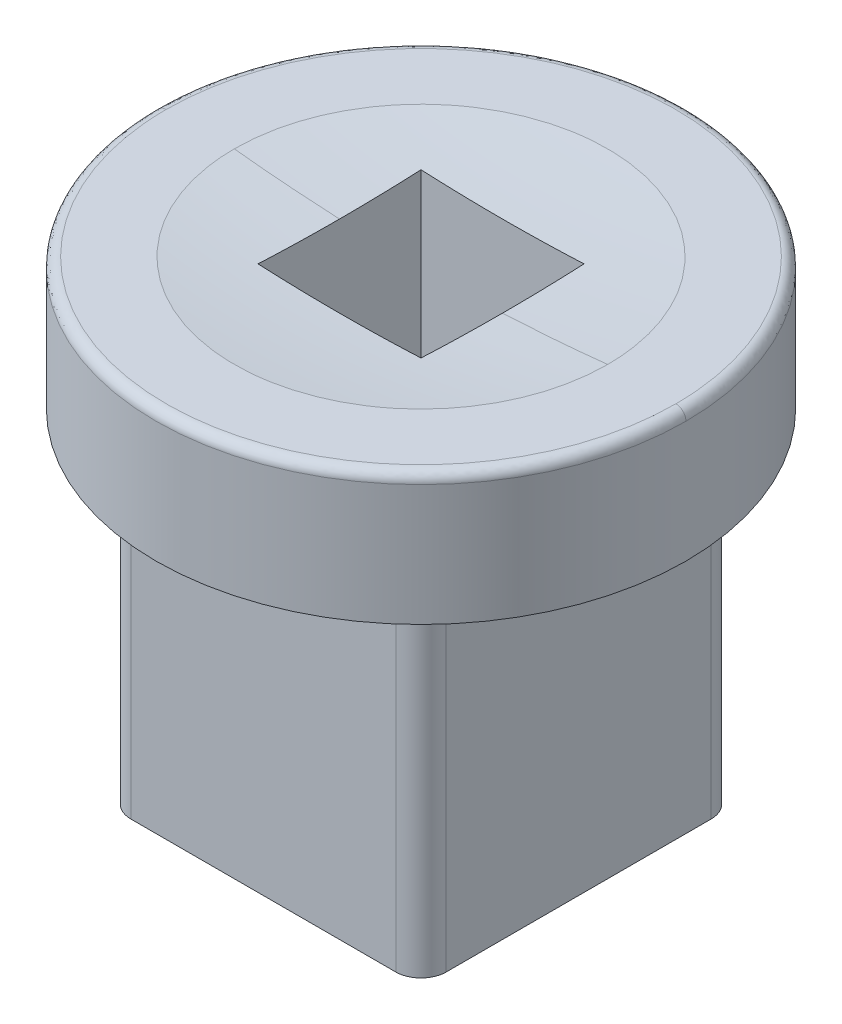
ISO-10303-21;
HEADER;
FILE_DESCRIPTION(('STEP AP214'),'2;1');
FILE_NAME('part.step','',(''),(''),'','','');
FILE_SCHEMA(('AUTOMOTIVE_DESIGN { 1 0 10303 214 1 1 1 1 }'));
ENDSEC;
DATA;
#1=APPLICATION_CONTEXT('core data for automotive mechanical design processes');
#2=APPLICATION_PROTOCOL_DEFINITION('international standard','automotive_design',2000,#1);
#3=PRODUCT_CONTEXT('',#1,'mechanical');
#4=PRODUCT('Part','Part','',(#3));
#5=PRODUCT_RELATED_PRODUCT_CATEGORY('part','',(#4));
#6=PRODUCT_DEFINITION_FORMATION('','',#4);
#7=PRODUCT_DEFINITION_CONTEXT('part definition',#1,'design');
#8=PRODUCT_DEFINITION('design','',#6,#7);
#9=PRODUCT_DEFINITION_SHAPE('','',#8);
#10=(LENGTH_UNIT() NAMED_UNIT(*) SI_UNIT(.MILLI.,.METRE.));
#11=(NAMED_UNIT(*) PLANE_ANGLE_UNIT() SI_UNIT($,.RADIAN.));
#12=(NAMED_UNIT(*) SI_UNIT($,.STERADIAN.) SOLID_ANGLE_UNIT());
#13=UNCERTAINTY_MEASURE_WITH_UNIT(LENGTH_MEASURE(1.E-05),#10,'distance_accuracy_value','');
#14=(GEOMETRIC_REPRESENTATION_CONTEXT(3) GLOBAL_UNCERTAINTY_ASSIGNED_CONTEXT((#13)) GLOBAL_UNIT_ASSIGNED_CONTEXT((#10,
#11,#12)) REPRESENTATION_CONTEXT('',''));
#15=CARTESIAN_POINT('',(0.,0.,0.));
#16=DIRECTION('',(0.,0.,1.));
#17=DIRECTION('',(1.,0.,0.));
#18=AXIS2_PLACEMENT_3D('',#15,#16,#17);
#19=CARTESIAN_POINT('',(1.60246612592846,6.28742605089468,0.));
#20=CARTESIAN_POINT('',(1.60246612592847,6.28742605089468,-3.20493225185692));
#21=CARTESIAN_POINT('',(-1.60246612592846,6.28742605089468,-3.20493225185693));
#22=CARTESIAN_POINT('',(-1.60246612592846,6.28742605089468,0.));
#23=CARTESIAN_POINT('',(2.30319517885633,6.32017536621334,0.));
#24=CARTESIAN_POINT('',(2.30319517885634,6.32017536621334,-4.60639035771267));
#25=CARTESIAN_POINT('',(-2.30319517885633,6.32017536621334,-4.60639035771268));
#26=CARTESIAN_POINT('',(-2.30319517885633,6.32017536621334,0.));
#27=CARTESIAN_POINT('',(3.00259213919021,6.37438361655492,0.));
#28=CARTESIAN_POINT('',(3.00259213919022,6.37438361655492,-6.00518427838042));
#29=CARTESIAN_POINT('',(-3.00259213919021,6.37438361655492,-6.00518427838043));
#30=CARTESIAN_POINT('',(-3.00259213919021,6.37438361655492,0.));
#31=CARTESIAN_POINT('',(3.70000000001531,6.45,0.));
#32=CARTESIAN_POINT('',(3.70000000001532,6.45,-7.40000000003062));
#33=CARTESIAN_POINT('',(-3.70000000001531,6.45,-7.40000000003063));
#34=CARTESIAN_POINT('',(-3.70000000001531,6.45,0.));
#35=(BOUNDED_SURFACE() B_SPLINE_SURFACE(3,3,((#19,#20,#21,#22),(#23,#24,#25,#26),(#27,#28,#29,
#30),(#31,#32,#33,#34)),.UNSPECIFIED.,.F.,.F.,.F.) B_SPLINE_SURFACE_WITH_KNOTS((4,4),(4,4),
(0.0134648712012432,0.98076619568123),(0.,1.),
.UNSPECIFIED.) GEOMETRIC_REPRESENTATION_ITEM() RATIONAL_B_SPLINE_SURFACE(((0.999986664041515,
0.333328888013838,0.333328888013838,0.999986664041515),(0.999671675900725,0.333223891966908,
0.333223891966908,0.999671675900725),(0.999669808465663,0.333223269488554,0.333223269488554,
0.999669808465663),(0.999981061736329,0.333327020578776,0.333327020578776,0.999981061736329))) REPRESENTATION_ITEM('') SURFACE());
#36=CARTESIAN_POINT('',(1.60246612592846,6.28742605089468,0.));
#37=CARTESIAN_POINT('',(2.30319517885633,6.32017536621333,0.));
#38=CARTESIAN_POINT('',(3.00259213919021,6.37438361655492,0.));
#39=CARTESIAN_POINT('',(3.70000000001531,6.45,0.));
#40=(BOUNDED_CURVE() B_SPLINE_CURVE(3,(#36,#37,#38,#39),.UNSPECIFIED.,.F.,
.F.) B_SPLINE_CURVE_WITH_KNOTS((4,4),(0.0134648712012412,0.98076619568123),
.UNSPECIFIED.) CURVE() GEOMETRIC_REPRESENTATION_ITEM() RATIONAL_B_SPLINE_CURVE((0.999986664041515,
0.999671675900725,0.999669808465663,0.999981061736329)) REPRESENTATION_ITEM(''));
#41=CARTESIAN_POINT('',(3.70000000001531,6.45,0.));
#42=VERTEX_POINT('',#41);
#43=CARTESIAN_POINT('',(1.615,6.28801413072135,0.));
#44=VERTEX_POINT('',#43);
#45=EDGE_CURVE('E130',#42,#44,#40,.F.);
#46=CARTESIAN_POINT('',(-3.70000000001531,6.45,0.));
#47=CARTESIAN_POINT('',(-3.70000996933506,6.45,-0.104065747110192));
#48=CARTESIAN_POINT('',(-3.695609624673,6.45,-0.208126765361193));
#49=CARTESIAN_POINT('',(-3.67806546197529,6.45,-0.415504310503129));
#50=CARTESIAN_POINT('',(-3.66492206259416,6.45,-0.518820872802333));
#51=CARTESIAN_POINT('',(-3.62998121590967,6.45,-0.723912470911236));
#52=CARTESIAN_POINT('',(-3.60818985820135,6.45,-0.825688539241989));
#53=CARTESIAN_POINT('',(-3.55612988346957,6.45,-1.0270183028877));
#54=CARTESIAN_POINT('',(-3.52586136945857,6.45,-1.12657202519223));
#55=CARTESIAN_POINT('',(-3.42258568149041,6.45000000000001,-1.42093586617541));
#56=CARTESIAN_POINT('',(-3.33709348688781,6.45,-1.61153550480342));
#57=CARTESIAN_POINT('',(-3.13538235508832,6.45,-1.97553244157834));
#58=CARTESIAN_POINT('',(-3.01916945442626,6.45,-2.14893311008045));
#59=CARTESIAN_POINT('',(-2.75927010205907,6.45,-2.47379728345372));
#60=CARTESIAN_POINT('',(-2.61558304468113,6.45,-2.62526030457602));
#61=CARTESIAN_POINT('',(-2.30480071448262,6.45,-2.90192918620794));
#62=CARTESIAN_POINT('',(-2.13770188012987,6.45,-3.02713104447086));
#63=CARTESIAN_POINT('',(-1.78486213469881,6.45,-3.24769895724202));
#64=CARTESIAN_POINT('',(-1.59912204690047,6.45,-3.3430663286076));
#65=CARTESIAN_POINT('',(-1.21427959257996,6.45,-3.50125768589281));
#66=CARTESIAN_POINT('',(-1.01517808174731,6.44999999999999,-3.56408375357364));
#67=CARTESIAN_POINT('',(-0.609249331839994,6.44999999999999,-3.65542007830035));
#68=CARTESIAN_POINT('',(-0.402421934533885,6.45,-3.68392963212279));
#69=CARTESIAN_POINT('',(0.0130883851862026,6.45,-3.7058213371475));
#70=CARTESIAN_POINT('',(0.221771350168899,6.44999999999999,-3.69920268038442));
#71=CARTESIAN_POINT('',(0.635062019699585,6.44999999999999,-3.65102429412023));
#72=CARTESIAN_POINT('',(0.839669764628466,6.45,-3.60946491101928));
#73=CARTESIAN_POINT('',(1.23900326382597,6.45,-3.49258538739663));
#74=CARTESIAN_POINT('',(1.43372904944246,6.45,-3.41726535397894));
#75=CARTESIAN_POINT('',(1.80777656844501,6.45,-3.23500052538178));
#76=CARTESIAN_POINT('',(1.98709789795484,6.45,-3.12805490136438));
#77=CARTESIAN_POINT('',(2.32523181409547,6.45,-2.88558064256865));
#78=CARTESIAN_POINT('',(2.48404541027658,6.45,-2.75005341566488));
#79=CARTESIAN_POINT('',(2.77664633742666,6.45,-2.45428346195446));
#80=CARTESIAN_POINT('',(2.91043702653755,6.45,-2.29404405686301));
#81=CARTESIAN_POINT('',(3.14926046163895,6.45,-1.95331587004096));
#82=CARTESIAN_POINT('',(3.25428405225189,6.45,-1.77282066743239));
#83=CARTESIAN_POINT('',(3.43258688835618,6.45,-1.39668356524684));
#84=CARTESIAN_POINT('',(3.5058468021628,6.45,-1.20103252680722));
#85=CARTESIAN_POINT('',(3.61836723875544,6.45,-0.800360645639277));
#86=CARTESIAN_POINT('',(3.65767968944249,6.45,-0.595354620420131));
#87=CARTESIAN_POINT('',(3.6863493945871,6.45,-0.324155563503965));
#88=CARTESIAN_POINT('',(3.69147107636447,6.45,-0.259373279639028));
#89=CARTESIAN_POINT('',(3.69829170517285,6.45,-0.12973607269225));
#90=CARTESIAN_POINT('',(3.69999629651804,6.45,-0.0648814467392098));
#91=CARTESIAN_POINT('',(3.70000000001531,6.45,0.));
#92=B_SPLINE_CURVE_WITH_KNOTS('',3,(#46,#47,#48,#49,#50,#51,#52,#53,#54,#55,#56,#57,#58,#59,#60,
#61,#62,#63,#64,#65,#66,#67,#68,#69,#70,#71,#72,#73,#74,#75,#76,#77,#78,#79,#80,#81,#82,#83,#84,
#85,#86,#87,#88,#89,#90,#91),.UNSPECIFIED.,.F.,.F.,(4,2,2,2,2,2,2,2,2,2,2,2,2,2,2,2,2,2,2,2,2,2,
4),(0.,0.312095712249736,0.624176481109523,0.936037882242793,1.24789549387231,1.87134971548028,
2.49468152098176,3.11802706953161,3.74146754810832,4.36488050490978,4.98825357525616,
5.61163941971741,6.23503960240795,6.85843360482086,7.48182562956034,8.10523399349649,
8.72861165671003,9.35190560082875,9.97539768374988,10.5992686992167,11.2221837082826,
11.4170742131284,11.6116425337463),.UNSPECIFIED.);
#93=CARTESIAN_POINT('',(-3.70000000001531,6.45,0.));
#94=VERTEX_POINT('',#93);
#95=EDGE_CURVE('E126',#94,#42,#92,.T.);
#96=CARTESIAN_POINT('',(-1.60246612592846,6.28742605089468,0.));
#97=CARTESIAN_POINT('',(-2.30319517885633,6.32017536621333,0.));
#98=CARTESIAN_POINT('',(-3.00259213919021,6.37438361655492,0.));
#99=CARTESIAN_POINT('',(-3.70000000001531,6.45,0.));
#100=(BOUNDED_CURVE() B_SPLINE_CURVE(3,(#96,#97,#98,#99),.UNSPECIFIED.,.F.,
.F.) B_SPLINE_CURVE_WITH_KNOTS((4,4),(0.0134648712012412,0.98076619568123),
.UNSPECIFIED.) CURVE() GEOMETRIC_REPRESENTATION_ITEM() RATIONAL_B_SPLINE_CURVE((0.999986664041515,
0.999671675900725,0.999669808465663,0.999981061736329)) REPRESENTATION_ITEM(''));
#101=CARTESIAN_POINT('',(-1.615,6.28801413072135,0.));
#102=VERTEX_POINT('',#101);
#103=EDGE_CURVE('E121',#102,#94,#100,.T.);
#104=CARTESIAN_POINT('',(-1.615,6.28801413072135,0.));
#105=CARTESIAN_POINT('',(-1.615,6.28801501096654,-0.269316107616103));
#106=CARTESIAN_POINT('',(-1.615,6.29118681141924,-0.538557494757486));
#107=CARTESIAN_POINT('',(-1.615,6.30387225273966,-1.07689082809081));
#108=CARTESIAN_POINT('',(-1.615,6.31338589360739,-1.34598277428276));
#109=CARTESIAN_POINT('',(-1.615,6.32607045468262,-1.61499999999998));
#110=B_SPLINE_CURVE_WITH_KNOTS('',3,(#104,#105,#106,#107,#108,#109),.UNSPECIFIED.,.F.,.F.,(4,2,
4),(0.,0.80778020761303,1.61556041522606),.UNSPECIFIED.);
#111=CARTESIAN_POINT('',(-1.61500000000001,6.32607045468262,-1.61499999999999));
#112=VERTEX_POINT('',#111);
#113=EDGE_CURVE('E124',#102,#112,#110,.T.);
#114=CARTESIAN_POINT('',(-1.61500000000002,6.32607045468262,-1.615));
#115=CARTESIAN_POINT('',(-1.07666666666667,6.30069957204177,-1.615));
#116=CARTESIAN_POINT('',(-0.538333333333326,6.28801413072135,-1.615));
#117=CARTESIAN_POINT('',(0.538333333333366,6.28801413072135,-1.615));
#118=CARTESIAN_POINT('',(1.07666666666671,6.30069957204178,-1.615));
#119=CARTESIAN_POINT('',(1.61500000000006,6.32607045468263,-1.615));
#120=B_SPLINE_CURVE_WITH_KNOTS('',3,(#114,#115,#116,#117,#118,#119),.UNSPECIFIED.,.F.,.F.,(4,2,
4),(0.,1.61544832284836,3.23089664569671),.UNSPECIFIED.);
#121=CARTESIAN_POINT('',(1.615,6.32607045468322,-1.61500000000002));
#122=VERTEX_POINT('',#121);
#123=EDGE_CURVE('E234',#112,#122,#120,.T.);
#124=CARTESIAN_POINT('',(1.615,6.32607045468262,-1.61500000000003));
#125=CARTESIAN_POINT('',(1.615,6.31338589360739,-1.3459827742828));
#126=CARTESIAN_POINT('',(1.615,6.30387225273966,-1.07689082809085));
#127=CARTESIAN_POINT('',(1.615,6.29118681141924,-0.538557494757502));
#128=CARTESIAN_POINT('',(1.615,6.28801501096654,-0.269316107616109));
#129=CARTESIAN_POINT('',(1.615,6.28801413072135,0.));
#130=B_SPLINE_CURVE_WITH_KNOTS('',3,(#124,#125,#126,#127,#128,#129),.UNSPECIFIED.,.F.,.F.,(4,2,
4),(0.,0.807780207613059,1.61556041522612),.UNSPECIFIED.);
#131=EDGE_CURVE('E233',#122,#44,#130,.T.);
#132=ORIENTED_EDGE('',*,*,#45,.F.);
#133=ORIENTED_EDGE('',*,*,#95,.F.);
#134=ORIENTED_EDGE('',*,*,#103,.F.);
#135=ORIENTED_EDGE('',*,*,#113,.T.);
#136=ORIENTED_EDGE('',*,*,#123,.T.);
#137=ORIENTED_EDGE('',*,*,#131,.T.);
#138=EDGE_LOOP('',(#132,#133,#134,#135,#136,#137));
#139=FACE_BOUND('',#138,.T.);
#140=ADVANCED_FACE('F18',(#139),#35,.T.);
#141=CARTESIAN_POINT('',(-1.60246612592846,6.28742605089468,0.));
#142=CARTESIAN_POINT('',(-1.60246612592847,6.28742605089468,3.20493225185692));
#143=CARTESIAN_POINT('',(1.60246612592846,6.28742605089468,3.20493225185692));
#144=CARTESIAN_POINT('',(1.60246612592846,6.28742605089468,0.));
#145=CARTESIAN_POINT('',(-2.30319517885633,6.32017536621333,0.));
#146=CARTESIAN_POINT('',(-2.30319517885635,6.32017536621333,4.60639035771267));
#147=CARTESIAN_POINT('',(2.30319517885633,6.32017536621333,4.60639035771268));
#148=CARTESIAN_POINT('',(2.30319517885633,6.32017536621333,0.));
#149=CARTESIAN_POINT('',(-3.00259213919021,6.37438361655492,0.));
#150=CARTESIAN_POINT('',(-3.00259213919023,6.37438361655492,6.00518427838042));
#151=CARTESIAN_POINT('',(3.00259213919021,6.37438361655492,6.00518427838043));
#152=CARTESIAN_POINT('',(3.00259213919021,6.37438361655492,0.));
#153=CARTESIAN_POINT('',(-3.70000000001531,6.45,0.));
#154=CARTESIAN_POINT('',(-3.70000000001533,6.45,7.40000000003062));
#155=CARTESIAN_POINT('',(3.70000000001531,6.45,7.40000000003064));
#156=CARTESIAN_POINT('',(3.70000000001531,6.45,0.));
#157=(BOUNDED_SURFACE() B_SPLINE_SURFACE(3,3,((#141,#142,#143,#144),(#145,#146,#147,#148),(#149,
#150,#151,#152),(#153,#154,#155,#156)),.UNSPECIFIED.,.F.,.F.,
.F.) B_SPLINE_SURFACE_WITH_KNOTS((4,4),(4,4),(0.0134648712012412,0.98076619568123),(0.,1.),
.UNSPECIFIED.) GEOMETRIC_REPRESENTATION_ITEM() RATIONAL_B_SPLINE_SURFACE(((0.999986664041515,
0.333328888013837,0.333328888013837,0.999986664041515),(0.999671675900725,0.333223891966907,
0.333223891966907,0.999671675900725),(0.999669808465663,0.333223269488553,0.333223269488553,
0.999669808465663),(0.999981061736329,0.333327020578775,0.333327020578775,0.999981061736329))) REPRESENTATION_ITEM('') SURFACE());
#158=CARTESIAN_POINT('',(1.615,6.28801413072135,0.));
#159=CARTESIAN_POINT('',(1.615,6.28801501096654,0.269316107616102));
#160=CARTESIAN_POINT('',(1.615,6.29118681141924,0.538557494757484));
#161=CARTESIAN_POINT('',(1.615,6.30387225273966,1.07689082809081));
#162=CARTESIAN_POINT('',(1.615,6.31338589360738,1.34598277428275));
#163=CARTESIAN_POINT('',(1.615,6.32607045468262,1.61499999999997));
#164=B_SPLINE_CURVE_WITH_KNOTS('',3,(#158,#159,#160,#161,#162,#163),.UNSPECIFIED.,.F.,.F.,(4,2,
4),(0.,0.807780207613026,1.61556041522605),.UNSPECIFIED.);
#165=CARTESIAN_POINT('',(1.61500000000001,6.32607045468262,1.61499999999998));
#166=VERTEX_POINT('',#165);
#167=EDGE_CURVE('E227',#44,#166,#164,.T.);
#168=CARTESIAN_POINT('',(1.61500000000001,6.32607045468262,1.615));
#169=CARTESIAN_POINT('',(1.07666666666668,6.30069957204177,1.615));
#170=CARTESIAN_POINT('',(0.53833333333335,6.28801413072135,1.615));
#171=CARTESIAN_POINT('',(-0.538333333333315,6.28801413072135,1.615));
#172=CARTESIAN_POINT('',(-1.07666666666665,6.30069957204178,1.615));
#173=CARTESIAN_POINT('',(-1.61499999999998,6.32607045468262,1.615));
#174=B_SPLINE_CURVE_WITH_KNOTS('',3,(#168,#169,#170,#171,#172,#173),.UNSPECIFIED.,.F.,.F.,(4,2,
4),(0.,1.61544832284832,3.23089664569663),.UNSPECIFIED.);
#175=CARTESIAN_POINT('',(-1.61499999999999,6.32607045468262,1.61499999999999));
#176=VERTEX_POINT('',#175);
#177=EDGE_CURVE('E137',#166,#176,#174,.T.);
#178=CARTESIAN_POINT('',(-1.615,6.32607045468262,1.61499999999998));
#179=CARTESIAN_POINT('',(-1.615,6.31338589360738,1.34598277428275));
#180=CARTESIAN_POINT('',(-1.615,6.30387225273966,1.07689082809081));
#181=CARTESIAN_POINT('',(-1.615,6.29118681141924,0.538557494757482));
#182=CARTESIAN_POINT('',(-1.615,6.28801501096654,0.269316107616098));
#183=CARTESIAN_POINT('',(-1.615,6.28801413072135,0.));
#184=B_SPLINE_CURVE_WITH_KNOTS('',3,(#178,#179,#180,#181,#182,#183),.UNSPECIFIED.,.F.,.F.,(4,2,
4),(0.,0.807780207613032,1.61556041522606),.UNSPECIFIED.);
#185=EDGE_CURVE('E24',#176,#102,#184,.T.);
#186=CARTESIAN_POINT('',(3.70000000001531,6.45,0.));
#187=CARTESIAN_POINT('',(3.70000996933506,6.45,0.104065747110191));
#188=CARTESIAN_POINT('',(3.695609624673,6.45,0.208126765361191));
#189=CARTESIAN_POINT('',(3.67806546197529,6.45,0.415504310503121));
#190=CARTESIAN_POINT('',(3.66492206259416,6.45,0.518820872802321));
#191=CARTESIAN_POINT('',(3.62998121590967,6.45,0.723912470911221));
#192=CARTESIAN_POINT('',(3.60818985820135,6.45,0.825688539241975));
#193=CARTESIAN_POINT('',(3.55612988346955,6.45,1.02701830288769));
#194=CARTESIAN_POINT('',(3.52586136945853,6.44999999999999,1.12657202519221));
#195=CARTESIAN_POINT('',(3.42258568149035,6.44999999999999,1.42093586617539));
#196=CARTESIAN_POINT('',(3.33709348688779,6.45,1.61153550480341));
#197=CARTESIAN_POINT('',(3.13538235508832,6.45,1.97553244157833));
#198=CARTESIAN_POINT('',(3.01916945442626,6.45,2.14893311008045));
#199=CARTESIAN_POINT('',(2.75927010205908,6.45,2.47379728345371));
#200=CARTESIAN_POINT('',(2.61558304468113,6.45,2.62526030457601));
#201=CARTESIAN_POINT('',(2.30480071448261,6.45,2.90192918620792));
#202=CARTESIAN_POINT('',(2.13770188012984,6.45,3.02713104447083));
#203=CARTESIAN_POINT('',(1.78486213469877,6.45,3.24769895724199));
#204=CARTESIAN_POINT('',(1.59912204690044,6.45,3.34306632860758));
#205=CARTESIAN_POINT('',(1.21427959257996,6.45,3.50125768589283));
#206=CARTESIAN_POINT('',(1.01517808174732,6.45,3.56408375357369));
#207=CARTESIAN_POINT('',(0.609249331840017,6.45,3.65542007830039));
#208=CARTESIAN_POINT('',(0.402421934533903,6.45,3.6839296321228));
#209=CARTESIAN_POINT('',(-0.0130883851861927,6.45,3.70582133714748));
#210=CARTESIAN_POINT('',(-0.221771350168891,6.44999999999999,3.69920268038441));
#211=CARTESIAN_POINT('',(-0.635062019699582,6.44999999999999,3.65102429412022));
#212=CARTESIAN_POINT('',(-0.839669764628466,6.45,3.60946491101928));
#213=CARTESIAN_POINT('',(-1.23900326382597,6.45,3.49258538739663));
#214=CARTESIAN_POINT('',(-1.43372904944245,6.45,3.41726535397894));
#215=CARTESIAN_POINT('',(-1.80777656844501,6.45,3.23500052538178));
#216=CARTESIAN_POINT('',(-1.98709789795484,6.45,3.12805490136439));
#217=CARTESIAN_POINT('',(-2.32523181409544,6.45,2.88558064256865));
#218=CARTESIAN_POINT('',(-2.48404541027653,6.44999999999999,2.75005341566485));
#219=CARTESIAN_POINT('',(-2.77664633742663,6.44999999999999,2.45428346195443));
#220=CARTESIAN_POINT('',(-2.91043702653755,6.45,2.29404405686301));
#221=CARTESIAN_POINT('',(-3.14926046163894,6.45,1.95331587004096));
#222=CARTESIAN_POINT('',(-3.25428405225184,6.44999999999999,1.77282066743238));
#223=CARTESIAN_POINT('',(-3.43258688835614,6.44999999999999,1.39668356524682));
#224=CARTESIAN_POINT('',(-3.50584680216281,6.45,1.20103252680722));
#225=CARTESIAN_POINT('',(-3.61836723875543,6.45,0.800360645639281));
#226=CARTESIAN_POINT('',(-3.65767968944242,6.44999999999999,0.595354620420123));
#227=CARTESIAN_POINT('',(-3.68634939458707,6.45,0.324155563503958));
#228=CARTESIAN_POINT('',(-3.69147107636446,6.45,0.259373279639023));
#229=CARTESIAN_POINT('',(-3.69829170517285,6.45,0.129736072692247));
#230=CARTESIAN_POINT('',(-3.69999629651803,6.45,0.0648814467392068));
#231=CARTESIAN_POINT('',(-3.70000000001525,6.44999999999999,0.));
#232=B_SPLINE_CURVE_WITH_KNOTS('',3,(#186,#187,#188,#189,#190,#191,#192,#193,#194,#195,#196,
#197,#198,#199,#200,#201,#202,#203,#204,#205,#206,#207,#208,#209,#210,#211,#212,#213,#214,#215,
#216,#217,#218,#219,#220,#221,#222,#223,#224,#225,#226,#227,#228,#229,#230,#231),.UNSPECIFIED.,
.F.,.F.,(4,2,2,2,2,2,2,2,2,2,2,2,2,2,2,2,2,2,2,2,2,2,4),(0.,0.312095712249731,0.624176481109507,
0.93603788224278,1.2478954938723,1.87134971548027,2.49468152098174,3.11802706953159,
3.74146754810832,4.36488050490977,4.98825357525613,5.61163941971738,6.23503960240794,
6.85843360482084,7.48182562956032,8.10523399349647,8.72861165671,9.35190560082872,
9.97539768374985,10.5992686992167,11.2221837082825,11.4170742131284,11.6116425337463),.UNSPECIFIED.);
#233=EDGE_CURVE('E193',#42,#94,#232,.T.);
#234=ORIENTED_EDGE('',*,*,#167,.T.);
#235=ORIENTED_EDGE('',*,*,#177,.T.);
#236=ORIENTED_EDGE('',*,*,#185,.T.);
#237=ORIENTED_EDGE('',*,*,#103,.T.);
#238=ORIENTED_EDGE('',*,*,#233,.F.);
#239=ORIENTED_EDGE('',*,*,#45,.T.);
#240=EDGE_LOOP('',(#234,#235,#236,#237,#238,#239));
#241=FACE_BOUND('',#240,.T.);
#242=ADVANCED_FACE('F140',(#241),#157,.T.);
#243=CARTESIAN_POINT('',(-1.615,6.511591863778,1.6796));
#244=DIRECTION('',(-1.,0.,0.));
#245=DIRECTION('',(0.,0.,1.));
#246=AXIS2_PLACEMENT_3D('',#243,#244,#245);
#247=PLANE('',#246);
#248=DIRECTION('',(0.,1.,0.));
#249=VECTOR('',#248,1.);
#250=CARTESIAN_POINT('',(-1.615,6.511591863778,-1.615));
#251=LINE('',#250,#249);
#252=CARTESIAN_POINT('',(-1.615,-2.95,-1.615));
#253=VERTEX_POINT('',#252);
#254=EDGE_CURVE('E136',#253,#112,#251,.T.);
#255=ORIENTED_EDGE('',*,*,#254,.T.);
#256=ORIENTED_EDGE('',*,*,#113,.F.);
#257=ORIENTED_EDGE('',*,*,#185,.F.);
#258=DIRECTION('',(0.,1.,0.));
#259=VECTOR('',#258,1.);
#260=CARTESIAN_POINT('',(-1.61499999999997,6.511591863778,1.615));
#261=LINE('',#260,#259);
#262=CARTESIAN_POINT('',(-1.61499999999999,-2.95,1.615));
#263=VERTEX_POINT('',#262);
#264=EDGE_CURVE('E341',#176,#263,#261,.F.);
#265=ORIENTED_EDGE('',*,*,#264,.T.);
#266=DIRECTION('',(0.,0.,-1.));
#267=VECTOR('',#266,1.);
#268=CARTESIAN_POINT('',(-1.615,-2.95,3.25));
#269=LINE('',#268,#267);
#270=EDGE_CURVE('E169',#253,#263,#269,.F.);
#271=ORIENTED_EDGE('',*,*,#270,.F.);
#272=EDGE_LOOP('',(#255,#256,#257,#265,#271));
#273=FACE_BOUND('',#272,.T.);
#274=ADVANCED_FACE('F133',(#273),#247,.F.);
#275=CARTESIAN_POINT('',(1.6796,6.511591863778,1.615));
#276=DIRECTION('',(0.,0.,1.));
#277=DIRECTION('',(1.,0.,0.));
#278=AXIS2_PLACEMENT_3D('',#275,#276,#277);
#279=PLANE('',#278);
#280=ORIENTED_EDGE('',*,*,#264,.F.);
#281=ORIENTED_EDGE('',*,*,#177,.F.);
#282=DIRECTION('',(0.,1.,0.));
#283=VECTOR('',#282,1.);
#284=CARTESIAN_POINT('',(1.615,6.511591863778,1.61499999999996));
#285=LINE('',#284,#283);
#286=CARTESIAN_POINT('',(1.615,-2.95,1.61499999999998));
#287=VERTEX_POINT('',#286);
#288=EDGE_CURVE('E232',#166,#287,#285,.F.);
#289=ORIENTED_EDGE('',*,*,#288,.T.);
#290=DIRECTION('',(1.,0.,0.));
#291=VECTOR('',#290,1.);
#292=CARTESIAN_POINT('',(3.25,-2.95,1.615));
#293=LINE('',#292,#291);
#294=EDGE_CURVE('E161',#263,#287,#293,.T.);
#295=ORIENTED_EDGE('',*,*,#294,.F.);
#296=EDGE_LOOP('',(#280,#281,#289,#295));
#297=FACE_BOUND('',#296,.T.);
#298=ADVANCED_FACE('F245',(#297),#279,.F.);
#299=CARTESIAN_POINT('',(1.615,6.511591863778,-1.6796));
#300=DIRECTION('',(1.,0.,0.));
#301=DIRECTION('',(0.,0.,-1.));
#302=AXIS2_PLACEMENT_3D('',#299,#300,#301);
#303=PLANE('',#302);
#304=DIRECTION('',(0.,0.,-1.));
#305=VECTOR('',#304,1.);
#306=CARTESIAN_POINT('',(1.615,-2.95,3.25));
#307=LINE('',#306,#305);
#308=CARTESIAN_POINT('',(1.615,-2.95,-1.615));
#309=VERTEX_POINT('',#308);
#310=EDGE_CURVE('E154',#287,#309,#307,.T.);
#311=ORIENTED_EDGE('',*,*,#310,.F.);
#312=ORIENTED_EDGE('',*,*,#288,.F.);
#313=ORIENTED_EDGE('',*,*,#167,.F.);
#314=ORIENTED_EDGE('',*,*,#131,.F.);
#315=DIRECTION('',(0.,1.,0.));
#316=VECTOR('',#315,1.);
#317=CARTESIAN_POINT('',(1.615,6.511591863778,-1.615));
#318=LINE('',#317,#316);
#319=EDGE_CURVE('E325',#122,#309,#318,.F.);
#320=ORIENTED_EDGE('',*,*,#319,.T.);
#321=EDGE_LOOP('',(#311,#312,#313,#314,#320));
#322=FACE_BOUND('',#321,.T.);
#323=ADVANCED_FACE('F241',(#322),#303,.F.);
#324=CARTESIAN_POINT('',(-1.6796,6.511591863778,-1.615));
#325=DIRECTION('',(0.,0.,-1.));
#326=DIRECTION('',(-1.,0.,0.));
#327=AXIS2_PLACEMENT_3D('',#324,#325,#326);
#328=PLANE('',#327);
#329=ORIENTED_EDGE('',*,*,#319,.F.);
#330=ORIENTED_EDGE('',*,*,#123,.F.);
#331=ORIENTED_EDGE('',*,*,#254,.F.);
#332=DIRECTION('',(1.,0.,0.));
#333=VECTOR('',#332,1.);
#334=CARTESIAN_POINT('',(3.25,-2.95,-1.615));
#335=LINE('',#334,#333);
#336=EDGE_CURVE('E160',#309,#253,#335,.F.);
#337=ORIENTED_EDGE('',*,*,#336,.F.);
#338=EDGE_LOOP('',(#329,#330,#331,#337));
#339=FACE_BOUND('',#338,.T.);
#340=ADVANCED_FACE('F244',(#339),#328,.F.);
#341=CARTESIAN_POINT('',(-5.252683135968,6.45,5.252000011937));
#342=DIRECTION('',(0.,1.,0.));
#343=DIRECTION('',(0.,0.,1.));
#344=AXIS2_PLACEMENT_3D('',#341,#342,#343);
#345=PLANE('',#344);
#346=CARTESIAN_POINT('',(-5.04999993397241,6.44999999999999,1.60537969580011E-12));
#347=CARTESIAN_POINT('',(-5.04999993397563,6.44999999999999,-10.0999998679464));
#348=CARTESIAN_POINT('',(5.04999993397241,6.44999999999999,-10.099999867948));
#349=CARTESIAN_POINT('',(5.04999993397241,6.44999999999999,0.));
#350=(BOUNDED_CURVE() B_SPLINE_CURVE(3,(#346,#347,#348,#349),.UNSPECIFIED.,.F.,
.F.) B_SPLINE_CURVE_WITH_KNOTS((4,4),(0.,1.),
.UNSPECIFIED.) CURVE() GEOMETRIC_REPRESENTATION_ITEM() RATIONAL_B_SPLINE_CURVE((0.95409653357363,
0.318032177857775,0.318032177857775,0.95409653357363)) REPRESENTATION_ITEM(''));
#351=CARTESIAN_POINT('',(5.04999993661328,6.44999999999999,-1.02765942488147E-12));
#352=VERTEX_POINT('',#351);
#353=CARTESIAN_POINT('',(-5.04999993661328,6.44999999999999,7.06982510105549E-13));
#354=VERTEX_POINT('',#353);
#355=EDGE_CURVE('E180',#352,#354,#350,.F.);
#356=ORIENTED_EDGE('',*,*,#355,.T.);
#357=CARTESIAN_POINT('',(5.04999993397241,6.44999999999999,-1.60537947207643E-12));
#358=CARTESIAN_POINT('',(5.04999993397562,6.44999999999999,10.0999998679464));
#359=CARTESIAN_POINT('',(-5.04999993397241,6.44999999999999,10.099999867948));
#360=CARTESIAN_POINT('',(-5.04999993397241,6.44999999999999,0.));
#361=(BOUNDED_CURVE() B_SPLINE_CURVE(3,(#357,#358,#359,#360),.UNSPECIFIED.,.F.,
.F.) B_SPLINE_CURVE_WITH_KNOTS((4,4),(0.,1.),
.UNSPECIFIED.) CURVE() GEOMETRIC_REPRESENTATION_ITEM() RATIONAL_B_SPLINE_CURVE((0.954096533573612,
0.31803217785777,0.31803217785777,0.954096533573612)) REPRESENTATION_ITEM(''));
#362=EDGE_CURVE('E376',#354,#352,#361,.F.);
#363=ORIENTED_EDGE('',*,*,#362,.T.);
#364=EDGE_LOOP('',(#356,#363));
#365=FACE_BOUND('',#364,.T.);
#366=ORIENTED_EDGE('',*,*,#95,.T.);
#367=ORIENTED_EDGE('',*,*,#233,.T.);
#368=EDGE_LOOP('',(#366,#367));
#369=FACE_BOUND('',#368,.T.);
#370=ADVANCED_FACE('F203',(#365,#369),#345,.T.);
#371=CARTESIAN_POINT('',(-2.625,-2.95,2.625));
#372=DIRECTION('',(0.,1.,0.));
#373=DIRECTION('',(0.,0.,1.));
#374=AXIS2_PLACEMENT_3D('',#371,#372,#373);
#375=CYLINDRICAL_SURFACE('',#374,0.5);
#376=DIRECTION('',(0.,1.,0.));
#377=VECTOR('',#376,1.);
#378=CARTESIAN_POINT('',(-2.625,3.986,3.125));
#379=LINE('',#378,#377);
#380=CARTESIAN_POINT('',(-2.625,3.85,3.125));
#381=VERTEX_POINT('',#380);
#382=CARTESIAN_POINT('',(-2.625,-2.95,3.125));
#383=VERTEX_POINT('',#382);
#384=EDGE_CURVE('E406',#381,#383,#379,.F.);
#385=ORIENTED_EDGE('',*,*,#384,.F.);
#386=CARTESIAN_POINT('',(-2.625,3.85,2.625));
#387=DIRECTION('',(0.,1.,0.));
#388=DIRECTION('',(0.,0.,1.));
#389=AXIS2_PLACEMENT_3D('',#386,#387,#388);
#390=CIRCLE('',#389,0.5);
#391=CARTESIAN_POINT('',(-3.125,3.85,2.625));
#392=VERTEX_POINT('',#391);
#393=EDGE_CURVE('E191',#381,#392,#390,.F.);
#394=ORIENTED_EDGE('',*,*,#393,.T.);
#395=DIRECTION('',(0.,1.,0.));
#396=VECTOR('',#395,1.);
#397=CARTESIAN_POINT('',(-3.125,3.986,2.625));
#398=LINE('',#397,#396);
#399=CARTESIAN_POINT('',(-3.125,-2.95,2.625));
#400=VERTEX_POINT('',#399);
#401=EDGE_CURVE('E405',#400,#392,#398,.T.);
#402=ORIENTED_EDGE('',*,*,#401,.F.);
#403=CARTESIAN_POINT('',(-2.625,-2.95,2.625));
#404=DIRECTION('',(0.,1.,0.));
#405=DIRECTION('',(0.,0.,1.));
#406=AXIS2_PLACEMENT_3D('',#403,#404,#405);
#407=CIRCLE('',#406,0.5);
#408=EDGE_CURVE('E185',#383,#400,#407,.F.);
#409=ORIENTED_EDGE('',*,*,#408,.F.);
#410=EDGE_LOOP('',(#385,#394,#402,#409));
#411=FACE_BOUND('',#410,.T.);
#412=ADVANCED_FACE('F426',(#411),#375,.T.);
#413=CARTESIAN_POINT('',(-2.625,-2.95,-2.625));
#414=DIRECTION('',(0.,1.,0.));
#415=DIRECTION('',(-1.,0.,0.));
#416=AXIS2_PLACEMENT_3D('',#413,#414,#415);
#417=CYLINDRICAL_SURFACE('',#416,0.5);
#418=DIRECTION('',(0.,1.,0.));
#419=VECTOR('',#418,1.);
#420=CARTESIAN_POINT('',(-3.125,3.986,-2.625));
#421=LINE('',#420,#419);
#422=CARTESIAN_POINT('',(-3.125,3.85,-2.625));
#423=VERTEX_POINT('',#422);
#424=CARTESIAN_POINT('',(-3.125,-2.95,-2.625));
#425=VERTEX_POINT('',#424);
#426=EDGE_CURVE('E401',#423,#425,#421,.F.);
#427=ORIENTED_EDGE('',*,*,#426,.F.);
#428=CARTESIAN_POINT('',(-2.625,3.85,-2.625));
#429=DIRECTION('',(0.,1.,0.));
#430=DIRECTION('',(-1.,0.,0.));
#431=AXIS2_PLACEMENT_3D('',#428,#429,#430);
#432=CIRCLE('',#431,0.5);
#433=CARTESIAN_POINT('',(-2.625,3.85,-3.125));
#434=VERTEX_POINT('',#433);
#435=EDGE_CURVE('E189',#423,#434,#432,.F.);
#436=ORIENTED_EDGE('',*,*,#435,.T.);
#437=DIRECTION('',(0.,1.,0.));
#438=VECTOR('',#437,1.);
#439=CARTESIAN_POINT('',(-2.625,3.986,-3.125));
#440=LINE('',#439,#438);
#441=CARTESIAN_POINT('',(-2.625,-2.95,-3.125));
#442=VERTEX_POINT('',#441);
#443=EDGE_CURVE('E396',#442,#434,#440,.T.);
#444=ORIENTED_EDGE('',*,*,#443,.F.);
#445=CARTESIAN_POINT('',(-2.625,-2.95,-2.625));
#446=DIRECTION('',(0.,1.,0.));
#447=DIRECTION('',(-1.,0.,0.));
#448=AXIS2_PLACEMENT_3D('',#445,#446,#447);
#449=CIRCLE('',#448,0.5);
#450=EDGE_CURVE('E183',#425,#442,#449,.F.);
#451=ORIENTED_EDGE('',*,*,#450,.F.);
#452=EDGE_LOOP('',(#427,#436,#444,#451));
#453=FACE_BOUND('',#452,.T.);
#454=ADVANCED_FACE('F431',(#453),#417,.T.);
#455=CARTESIAN_POINT('',(2.625,-2.95,2.625));
#456=DIRECTION('',(0.,1.,0.));
#457=DIRECTION('',(-1.,0.,0.));
#458=AXIS2_PLACEMENT_3D('',#455,#456,#457);
#459=CYLINDRICAL_SURFACE('',#458,0.5);
#460=DIRECTION('',(0.,1.,0.));
#461=VECTOR('',#460,1.);
#462=CARTESIAN_POINT('',(3.125,3.986,2.625));
#463=LINE('',#462,#461);
#464=CARTESIAN_POINT('',(3.125,3.85,2.625));
#465=VERTEX_POINT('',#464);
#466=CARTESIAN_POINT('',(3.125,-2.95,2.625));
#467=VERTEX_POINT('',#466);
#468=EDGE_CURVE('E392',#465,#467,#463,.F.);
#469=ORIENTED_EDGE('',*,*,#468,.F.);
#470=CARTESIAN_POINT('',(2.625,3.85,2.625));
#471=DIRECTION('',(0.,1.,0.));
#472=DIRECTION('',(-1.,0.,0.));
#473=AXIS2_PLACEMENT_3D('',#470,#471,#472);
#474=CIRCLE('',#473,0.5);
#475=CARTESIAN_POINT('',(2.625,3.85,3.125));
#476=VERTEX_POINT('',#475);
#477=EDGE_CURVE('E172',#465,#476,#474,.F.);
#478=ORIENTED_EDGE('',*,*,#477,.T.);
#479=DIRECTION('',(0.,1.,0.));
#480=VECTOR('',#479,1.);
#481=CARTESIAN_POINT('',(2.625,3.986,3.125));
#482=LINE('',#481,#480);
#483=CARTESIAN_POINT('',(2.625,-2.95,3.125));
#484=VERTEX_POINT('',#483);
#485=EDGE_CURVE('E378',#484,#476,#482,.T.);
#486=ORIENTED_EDGE('',*,*,#485,.F.);
#487=CARTESIAN_POINT('',(2.625,-2.95,2.625));
#488=DIRECTION('',(0.,1.,0.));
#489=DIRECTION('',(-1.,0.,0.));
#490=AXIS2_PLACEMENT_3D('',#487,#488,#489);
#491=CIRCLE('',#490,0.5);
#492=EDGE_CURVE('E166',#467,#484,#491,.F.);
#493=ORIENTED_EDGE('',*,*,#492,.F.);
#494=EDGE_LOOP('',(#469,#478,#486,#493));
#495=FACE_BOUND('',#494,.T.);
#496=ADVANCED_FACE('F493',(#495),#459,.T.);
#497=CARTESIAN_POINT('',(3.25,-2.95,3.25));
#498=DIRECTION('',(0.,-1.,0.));
#499=DIRECTION('',(0.,0.,-1.));
#500=AXIS2_PLACEMENT_3D('',#497,#498,#499);
#501=PLANE('',#500);
#502=ORIENTED_EDGE('',*,*,#450,.T.);
#503=DIRECTION('',(-1.,0.,0.));
#504=VECTOR('',#503,1.);
#505=CARTESIAN_POINT('',(-2.73,-2.95,-3.125));
#506=LINE('',#505,#504);
#507=CARTESIAN_POINT('',(2.625,-2.95,-3.125));
#508=VERTEX_POINT('',#507);
#509=EDGE_CURVE('E393',#508,#442,#506,.T.);
#510=ORIENTED_EDGE('',*,*,#509,.F.);
#511=CARTESIAN_POINT('',(2.625,-2.95,-2.625));
#512=DIRECTION('',(0.,1.,0.));
#513=DIRECTION('',(0.,0.,1.));
#514=AXIS2_PLACEMENT_3D('',#511,#512,#513);
#515=CIRCLE('',#514,0.5);
#516=CARTESIAN_POINT('',(3.125,-2.95,-2.625));
#517=VERTEX_POINT('',#516);
#518=EDGE_CURVE('E181',#517,#508,#515,.T.);
#519=ORIENTED_EDGE('',*,*,#518,.F.);
#520=DIRECTION('',(0.,0.,-1.));
#521=VECTOR('',#520,1.);
#522=CARTESIAN_POINT('',(3.125,-2.95,-2.73));
#523=LINE('',#522,#521);
#524=EDGE_CURVE('E387',#467,#517,#523,.T.);
#525=ORIENTED_EDGE('',*,*,#524,.F.);
#526=ORIENTED_EDGE('',*,*,#492,.T.);
#527=DIRECTION('',(1.,0.,0.));
#528=VECTOR('',#527,1.);
#529=CARTESIAN_POINT('',(2.73,-2.95,3.125));
#530=LINE('',#529,#528);
#531=EDGE_CURVE('E402',#383,#484,#530,.T.);
#532=ORIENTED_EDGE('',*,*,#531,.F.);
#533=ORIENTED_EDGE('',*,*,#408,.T.);
#534=DIRECTION('',(0.,0.,1.));
#535=VECTOR('',#534,1.);
#536=CARTESIAN_POINT('',(-3.125,-2.95,2.73));
#537=LINE('',#536,#535);
#538=EDGE_CURVE('E398',#425,#400,#537,.T.);
#539=ORIENTED_EDGE('',*,*,#538,.F.);
#540=EDGE_LOOP('',(#502,#510,#519,#525,#526,#532,#533,#539));
#541=FACE_BOUND('',#540,.T.);
#542=ORIENTED_EDGE('',*,*,#310,.T.);
#543=ORIENTED_EDGE('',*,*,#336,.T.);
#544=ORIENTED_EDGE('',*,*,#270,.T.);
#545=ORIENTED_EDGE('',*,*,#294,.T.);
#546=EDGE_LOOP('',(#542,#543,#544,#545));
#547=FACE_BOUND('',#546,.T.);
#548=ADVANCED_FACE('F354',(#541,#547),#501,.T.);
#549=CARTESIAN_POINT('',(2.625,-2.95,-2.625));
#550=DIRECTION('',(0.,1.,0.));
#551=DIRECTION('',(0.,0.,1.));
#552=AXIS2_PLACEMENT_3D('',#549,#550,#551);
#553=CYLINDRICAL_SURFACE('',#552,0.5);
#554=DIRECTION('',(0.,1.,0.));
#555=VECTOR('',#554,1.);
#556=CARTESIAN_POINT('',(2.625,3.986,-3.125));
#557=LINE('',#556,#555);
#558=CARTESIAN_POINT('',(2.625,3.85,-3.125));
#559=VERTEX_POINT('',#558);
#560=EDGE_CURVE('E397',#559,#508,#557,.F.);
#561=ORIENTED_EDGE('',*,*,#560,.F.);
#562=CARTESIAN_POINT('',(2.625,3.85,-2.625));
#563=DIRECTION('',(0.,1.,0.));
#564=DIRECTION('',(0.,0.,1.));
#565=AXIS2_PLACEMENT_3D('',#562,#563,#564);
#566=CIRCLE('',#565,0.5);
#567=CARTESIAN_POINT('',(3.125,3.85,-2.625));
#568=VERTEX_POINT('',#567);
#569=EDGE_CURVE('E43',#559,#568,#566,.F.);
#570=ORIENTED_EDGE('',*,*,#569,.T.);
#571=DIRECTION('',(0.,1.,0.));
#572=VECTOR('',#571,1.);
#573=CARTESIAN_POINT('',(3.125,3.986,-2.625));
#574=LINE('',#573,#572);
#575=EDGE_CURVE('E370',#517,#568,#574,.T.);
#576=ORIENTED_EDGE('',*,*,#575,.F.);
#577=ORIENTED_EDGE('',*,*,#518,.T.);
#578=EDGE_LOOP('',(#561,#570,#576,#577));
#579=FACE_BOUND('',#578,.T.);
#580=ADVANCED_FACE('F510',(#579),#553,.T.);
#581=CARTESIAN_POINT('',(5.24999999999989,6.25,0.));
#582=CARTESIAN_POINT('',(5.24999999999989,6.25,-10.5000000000031));
#583=CARTESIAN_POINT('',(-5.25000000000323,6.25,-10.5000000000015));
#584=CARTESIAN_POINT('',(-5.24999999999989,6.25,1.66895629385472E-12));
#585=CARTESIAN_POINT('',(5.2499999999999,6.3671573057178,0.));
#586=CARTESIAN_POINT('',(5.2499999999999,6.3671573057178,-10.5000000000031));
#587=CARTESIAN_POINT('',(-5.25000000000323,6.3671573057178,-10.5000000000015));
#588=CARTESIAN_POINT('',(-5.2499999999999,6.3671573057178,1.66895678268087E-12));
#589=CARTESIAN_POINT('',(5.1671572646404,6.45000003867825,0.));
#590=CARTESIAN_POINT('',(5.1671572646404,6.45000003867825,-10.3343145292841));
#591=CARTESIAN_POINT('',(-5.16715726464368,6.45000003867825,-10.3343145292824));
#592=CARTESIAN_POINT('',(-5.1671572646404,6.45000003867825,1.64261577082864E-12));
#593=CARTESIAN_POINT('',(5.049999933972,6.44999999999999,0.));
#594=CARTESIAN_POINT('',(5.049999933972,6.44999999999999,-10.0999998679472));
#595=CARTESIAN_POINT('',(-5.04999993397521,6.44999999999999,-10.0999998679456));
#596=CARTESIAN_POINT('',(-5.049999933972,6.44999999999999,1.60537969579998E-12));
#597=(BOUNDED_SURFACE() B_SPLINE_SURFACE(3,3,((#581,#582,#583,#584),(#585,#586,#587,#588),(#589,
#590,#591,#592),(#593,#594,#595,#596)),.UNSPECIFIED.,.F.,.F.,
.F.) B_SPLINE_SURFACE_WITH_KNOTS((4,4),(4,4),(0.0662043707951803,0.933794867717665),(0.,1.),
.UNSPECIFIED.) GEOMETRIC_REPRESENTATION_ITEM() RATIONAL_B_SPLINE_SURFACE(((0.954097024120413,
0.31803234137337,0.31803234137337,0.954097024120413),(0.767797801951608,0.255932600650455,
0.255932600650455,0.767797801951608),(0.767797638436285,0.255932546145347,0.255932546145347,
0.767797638436285),(0.954096533574445,0.318032177858047,0.318032177858047,0.954096533574445))) REPRESENTATION_ITEM('') SURFACE());
#598=CARTESIAN_POINT('',(5.2499999999999,6.25,-1.66875447614808E-12));
#599=CARTESIAN_POINT('',(5.2499999999999,6.3671573057178,-1.66875126019333E-12));
#600=CARTESIAN_POINT('',(5.1671572646404,6.45000003867825,-1.64250047540544E-12));
#601=CARTESIAN_POINT('',(5.049999933972,6.44999999999999,-1.6053794720763E-12));
#602=(BOUNDED_CURVE() B_SPLINE_CURVE(3,(#598,#599,#600,#601),.UNSPECIFIED.,.F.,
.F.) B_SPLINE_CURVE_WITH_KNOTS((4,4),(0.0662043707951816,0.933794867717637),
.UNSPECIFIED.) CURVE() GEOMETRIC_REPRESENTATION_ITEM() RATIONAL_B_SPLINE_CURVE((0.95409702412041,
0.767797801951601,0.767797638436272,0.954096533574424)) REPRESENTATION_ITEM(''));
#603=CARTESIAN_POINT('',(5.24999999999997,6.25,-8.34259068830573E-13));
#604=VERTEX_POINT('',#603);
#605=EDGE_CURVE('E367',#352,#604,#602,.F.);
#606=CARTESIAN_POINT('',(0.,6.25,0.));
#607=DIRECTION('',(0.,1.,0.));
#608=DIRECTION('',(0.,0.,1.));
#609=AXIS2_PLACEMENT_3D('',#606,#607,#608);
#610=CIRCLE('',#609,5.25);
#611=CARTESIAN_POINT('',(-5.24999999999997,6.25,2.7915528793308E-13));
#612=VERTEX_POINT('',#611);
#613=EDGE_CURVE('E363',#612,#604,#610,.F.);
#614=CARTESIAN_POINT('',(-5.2499999999999,6.25,0.));
#615=CARTESIAN_POINT('',(-5.2499999999999,6.3671573057178,0.));
#616=CARTESIAN_POINT('',(-5.1671572646404,6.45000003867825,0.));
#617=CARTESIAN_POINT('',(-5.049999933972,6.44999999999999,0.));
#618=(BOUNDED_CURVE() B_SPLINE_CURVE(3,(#614,#615,#616,#617),.UNSPECIFIED.,.F.,
.F.) B_SPLINE_CURVE_WITH_KNOTS((4,4),(0.0662043707951816,0.933794867717637),
.UNSPECIFIED.) CURVE() GEOMETRIC_REPRESENTATION_ITEM() RATIONAL_B_SPLINE_CURVE((0.95409702412041,
0.767797801951601,0.767797638436272,0.954096533574424)) REPRESENTATION_ITEM(''));
#619=EDGE_CURVE('E366',#612,#354,#618,.T.);
#620=ORIENTED_EDGE('',*,*,#605,.T.);
#621=ORIENTED_EDGE('',*,*,#613,.F.);
#622=ORIENTED_EDGE('',*,*,#619,.T.);
#623=ORIENTED_EDGE('',*,*,#355,.F.);
#624=EDGE_LOOP('',(#620,#621,#622,#623));
#625=FACE_BOUND('',#624,.T.);
#626=ADVANCED_FACE('F291',(#625),#597,.F.);
#627=CARTESIAN_POINT('',(-5.2499999999999,6.25,0.));
#628=CARTESIAN_POINT('',(-5.2499999999999,6.25,10.5000000000031));
#629=CARTESIAN_POINT('',(5.25000000000323,6.25,10.5000000000015));
#630=CARTESIAN_POINT('',(5.2499999999999,6.25,-1.66875447614808E-12));
#631=CARTESIAN_POINT('',(-5.2499999999999,6.3671573057178,0.));
#632=CARTESIAN_POINT('',(-5.2499999999999,6.3671573057178,10.5000000000031));
#633=CARTESIAN_POINT('',(5.25000000000323,6.3671573057178,10.5000000000015));
#634=CARTESIAN_POINT('',(5.2499999999999,6.3671573057178,-1.66875126019333E-12));
#635=CARTESIAN_POINT('',(-5.1671572646404,6.45000003867825,0.));
#636=CARTESIAN_POINT('',(-5.1671572646404,6.45000003867825,10.3343145292841));
#637=CARTESIAN_POINT('',(5.16715726464368,6.45000003867825,10.3343145292824));
#638=CARTESIAN_POINT('',(5.1671572646404,6.45000003867825,-1.64250047540544E-12));
#639=CARTESIAN_POINT('',(-5.049999933972,6.44999999999999,0.));
#640=CARTESIAN_POINT('',(-5.049999933972,6.44999999999999,10.0999998679472));
#641=CARTESIAN_POINT('',(5.04999993397521,6.44999999999999,10.0999998679456));
#642=CARTESIAN_POINT('',(5.049999933972,6.44999999999999,-1.6053794720763E-12));
#643=(BOUNDED_SURFACE() B_SPLINE_SURFACE(3,3,((#627,#628,#629,#630),(#631,#632,#633,#634),(#635,
#636,#637,#638),(#639,#640,#641,#642)),.UNSPECIFIED.,.F.,.F.,
.F.) B_SPLINE_SURFACE_WITH_KNOTS((4,4),(4,4),(0.0662043707951816,0.933794867717637),(0.,1.),
.UNSPECIFIED.) GEOMETRIC_REPRESENTATION_ITEM() RATIONAL_B_SPLINE_SURFACE(((0.95409702412041,
0.318032341373369,0.318032341373369,0.95409702412041),(0.767797801951601,0.255932600650452,
0.255932600650452,0.767797801951601),(0.767797638436272,0.255932546145343,0.255932546145343,
0.767797638436272),(0.954096533574424,0.31803217785804,0.31803217785804,0.954096533574424))) REPRESENTATION_ITEM('') SURFACE());
#644=CARTESIAN_POINT('',(0.,6.25,0.));
#645=DIRECTION('',(0.,1.,0.));
#646=DIRECTION('',(0.,0.,1.));
#647=AXIS2_PLACEMENT_3D('',#644,#645,#646);
#648=CIRCLE('',#647,5.25);
#649=EDGE_CURVE('E369',#604,#612,#648,.F.);
#650=ORIENTED_EDGE('',*,*,#619,.F.);
#651=ORIENTED_EDGE('',*,*,#649,.F.);
#652=ORIENTED_EDGE('',*,*,#605,.F.);
#653=ORIENTED_EDGE('',*,*,#362,.F.);
#654=EDGE_LOOP('',(#650,#651,#652,#653));
#655=FACE_BOUND('',#654,.T.);
#656=ADVANCED_FACE('F284',(#655),#643,.F.);
#657=CARTESIAN_POINT('',(2.73,3.986,3.125));
#658=DIRECTION('',(0.,0.,1.));
#659=DIRECTION('',(1.,0.,0.));
#660=AXIS2_PLACEMENT_3D('',#657,#658,#659);
#661=PLANE('',#660);
#662=ORIENTED_EDGE('',*,*,#384,.T.);
#663=ORIENTED_EDGE('',*,*,#531,.T.);
#664=ORIENTED_EDGE('',*,*,#485,.T.);
#665=DIRECTION('',(1.,0.,0.));
#666=VECTOR('',#665,1.);
#667=CARTESIAN_POINT('',(-5.46,3.85,3.125));
#668=LINE('',#667,#666);
#669=EDGE_CURVE('E373',#476,#381,#668,.F.);
#670=ORIENTED_EDGE('',*,*,#669,.T.);
#671=EDGE_LOOP('',(#662,#663,#664,#670));
#672=FACE_BOUND('',#671,.T.);
#673=ADVANCED_FACE('F280',(#672),#661,.T.);
#674=CARTESIAN_POINT('',(-3.125,3.986,2.73));
#675=DIRECTION('',(-1.,0.,0.));
#676=DIRECTION('',(0.,0.,1.));
#677=AXIS2_PLACEMENT_3D('',#674,#675,#676);
#678=PLANE('',#677);
#679=ORIENTED_EDGE('',*,*,#426,.T.);
#680=ORIENTED_EDGE('',*,*,#538,.T.);
#681=ORIENTED_EDGE('',*,*,#401,.T.);
#682=DIRECTION('',(0.,0.,1.));
#683=VECTOR('',#682,1.);
#684=CARTESIAN_POINT('',(-3.125,3.85,5.461841644321));
#685=LINE('',#684,#683);
#686=EDGE_CURVE('E580',#392,#423,#685,.F.);
#687=ORIENTED_EDGE('',*,*,#686,.T.);
#688=EDGE_LOOP('',(#679,#680,#681,#687));
#689=FACE_BOUND('',#688,.T.);
#690=ADVANCED_FACE('F276',(#689),#678,.T.);
#691=CARTESIAN_POINT('',(-2.73,3.986,-3.125));
#692=DIRECTION('',(0.,0.,-1.));
#693=DIRECTION('',(-1.,0.,0.));
#694=AXIS2_PLACEMENT_3D('',#691,#692,#693);
#695=PLANE('',#694);
#696=ORIENTED_EDGE('',*,*,#443,.T.);
#697=DIRECTION('',(1.,0.,0.));
#698=VECTOR('',#697,1.);
#699=CARTESIAN_POINT('',(-5.46,3.85,-3.125));
#700=LINE('',#699,#698);
#701=EDGE_CURVE('E578',#434,#559,#700,.T.);
#702=ORIENTED_EDGE('',*,*,#701,.T.);
#703=ORIENTED_EDGE('',*,*,#560,.T.);
#704=ORIENTED_EDGE('',*,*,#509,.T.);
#705=EDGE_LOOP('',(#696,#702,#703,#704));
#706=FACE_BOUND('',#705,.T.);
#707=ADVANCED_FACE('F272',(#706),#695,.T.);
#708=CARTESIAN_POINT('',(3.125,3.986,-2.73));
#709=DIRECTION('',(1.,0.,0.));
#710=DIRECTION('',(0.,0.,-1.));
#711=AXIS2_PLACEMENT_3D('',#708,#709,#710);
#712=PLANE('',#711);
#713=ORIENTED_EDGE('',*,*,#575,.T.);
#714=DIRECTION('',(0.,0.,1.));
#715=VECTOR('',#714,1.);
#716=CARTESIAN_POINT('',(3.125,3.85,5.461841644321));
#717=LINE('',#716,#715);
#718=EDGE_CURVE('E34',#568,#465,#717,.T.);
#719=ORIENTED_EDGE('',*,*,#718,.T.);
#720=ORIENTED_EDGE('',*,*,#468,.T.);
#721=ORIENTED_EDGE('',*,*,#524,.T.);
#722=EDGE_LOOP('',(#713,#719,#720,#721));
#723=FACE_BOUND('',#722,.T.);
#724=ADVANCED_FACE('F264',(#723),#712,.T.);
#725=CARTESIAN_POINT('',(0.,3.85,0.));
#726=DIRECTION('',(0.,1.,0.));
#727=DIRECTION('',(0.,0.,1.));
#728=AXIS2_PLACEMENT_3D('',#725,#726,#727);
#729=CYLINDRICAL_SURFACE('',#728,5.25);
#730=ORIENTED_EDGE('',*,*,#649,.T.);
#731=ORIENTED_EDGE('',*,*,#613,.T.);
#732=EDGE_LOOP('',(#730,#731));
#733=FACE_BOUND('',#732,.T.);
#734=CARTESIAN_POINT('',(0.,3.85,0.));
#735=DIRECTION('',(0.,1.,0.));
#736=DIRECTION('',(0.,0.,1.));
#737=AXIS2_PLACEMENT_3D('',#734,#735,#736);
#738=CIRCLE('',#737,5.25);
#739=CARTESIAN_POINT('',(0.,3.85,5.25));
#740=VERTEX_POINT('',#739);
#741=EDGE_CURVE('E11',#740,#740,#738,.T.);
#742=ORIENTED_EDGE('',*,*,#741,.T.);
#743=EDGE_LOOP('',(#742));
#744=FACE_BOUND('',#743,.T.);
#745=ADVANCED_FACE('F258',(#733,#744),#729,.T.);
#746=CARTESIAN_POINT('',(-5.46,3.85,5.461841644321));
#747=DIRECTION('',(0.,1.,0.));
#748=DIRECTION('',(0.,0.,1.));
#749=AXIS2_PLACEMENT_3D('',#746,#747,#748);
#750=PLANE('',#749);
#751=ORIENTED_EDGE('',*,*,#741,.F.);
#752=EDGE_LOOP('',(#751));
#753=FACE_BOUND('',#752,.T.);
#754=ORIENTED_EDGE('',*,*,#569,.F.);
#755=ORIENTED_EDGE('',*,*,#701,.F.);
#756=ORIENTED_EDGE('',*,*,#435,.F.);
#757=ORIENTED_EDGE('',*,*,#686,.F.);
#758=ORIENTED_EDGE('',*,*,#393,.F.);
#759=ORIENTED_EDGE('',*,*,#669,.F.);
#760=ORIENTED_EDGE('',*,*,#477,.F.);
#761=ORIENTED_EDGE('',*,*,#718,.F.);
#762=EDGE_LOOP('',(#754,#755,#756,#757,#758,#759,#760,#761));
#763=FACE_BOUND('',#762,.T.);
#764=ADVANCED_FACE('F256',(#753,#763),#750,.F.);
#765=CLOSED_SHELL('',(#140,#242,#274,#298,#323,#340,#370,#412,#454,#496,#548,#580,#626,#656,
#673,#690,#707,#724,#745,#764));
#766=MANIFOLD_SOLID_BREP('B1',#765);
#767=ADVANCED_BREP_SHAPE_REPRESENTATION('',(#18,#766),#14);
#768=SHAPE_DEFINITION_REPRESENTATION(#9,#767);
ENDSEC;
END-ISO-10303-21;
